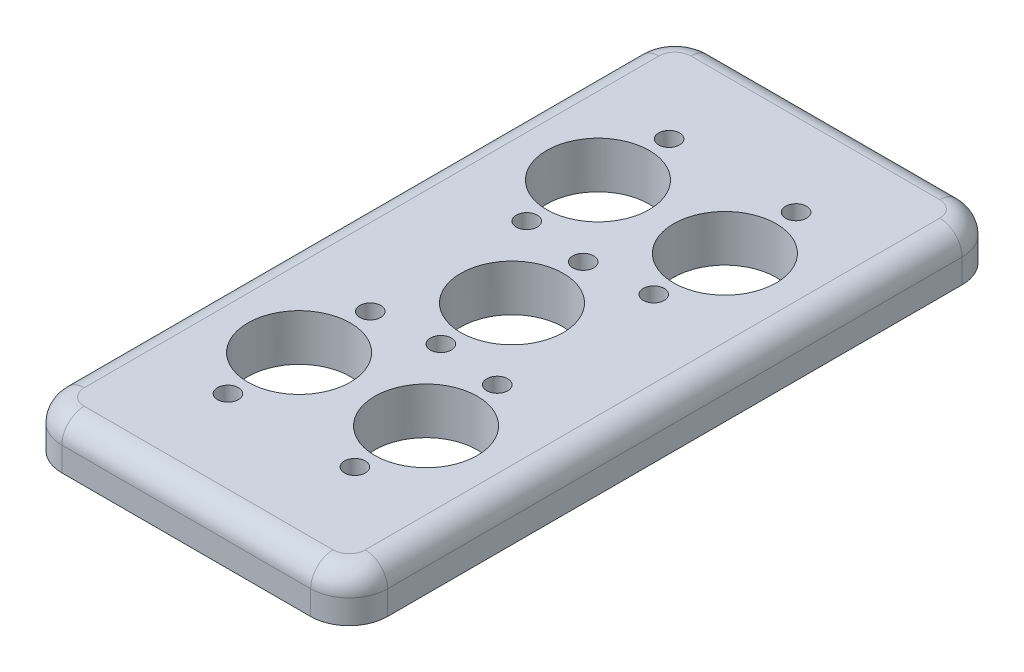
ISO-10303-21;
HEADER;
FILE_DESCRIPTION(('STEP AP214'),'2;1');
FILE_NAME('part.step','',(''),(''),'','','');
FILE_SCHEMA(('AUTOMOTIVE_DESIGN { 1 0 10303 214 1 1 1 1 }'));
ENDSEC;
DATA;
#1=APPLICATION_CONTEXT('core data for automotive mechanical design processes');
#2=APPLICATION_PROTOCOL_DEFINITION('international standard','automotive_design',2000,#1);
#3=PRODUCT_CONTEXT('',#1,'mechanical');
#4=PRODUCT('Part','Part','',(#3));
#5=PRODUCT_RELATED_PRODUCT_CATEGORY('part','',(#4));
#6=PRODUCT_DEFINITION_FORMATION('','',#4);
#7=PRODUCT_DEFINITION_CONTEXT('part definition',#1,'design');
#8=PRODUCT_DEFINITION('design','',#6,#7);
#9=PRODUCT_DEFINITION_SHAPE('','',#8);
#10=(LENGTH_UNIT() NAMED_UNIT(*) SI_UNIT(.MILLI.,.METRE.));
#11=(NAMED_UNIT(*) PLANE_ANGLE_UNIT() SI_UNIT($,.RADIAN.));
#12=(NAMED_UNIT(*) SI_UNIT($,.STERADIAN.) SOLID_ANGLE_UNIT());
#13=UNCERTAINTY_MEASURE_WITH_UNIT(LENGTH_MEASURE(1.E-05),#10,'distance_accuracy_value','');
#14=(GEOMETRIC_REPRESENTATION_CONTEXT(3) GLOBAL_UNCERTAINTY_ASSIGNED_CONTEXT((#13)) GLOBAL_UNIT_ASSIGNED_CONTEXT((#10,
#11,#12)) REPRESENTATION_CONTEXT('',''));
#15=CARTESIAN_POINT('',(0.,0.,0.));
#16=DIRECTION('',(0.,0.,1.));
#17=DIRECTION('',(1.,0.,0.));
#18=AXIS2_PLACEMENT_3D('',#15,#16,#17);
#19=CARTESIAN_POINT('',(25.4,7.25,-50.8));
#20=DIRECTION('',(-1.,0.,0.));
#21=DIRECTION('',(0.,0.,1.));
#22=AXIS2_PLACEMENT_3D('',#19,#20,#21);
#23=PLANE('',#22);
#24=DIRECTION('',(0.,-1.,0.));
#25=VECTOR('',#24,1.);
#26=CARTESIAN_POINT('',(25.4,7.25,-44.8));
#27=LINE('',#26,#25);
#28=CARTESIAN_POINT('',(25.4,0.,-44.8));
#29=VERTEX_POINT('',#28);
#30=CARTESIAN_POINT('',(25.4,3.75,-44.8));
#31=VERTEX_POINT('',#30);
#32=EDGE_CURVE('E135',#29,#31,#27,.F.);
#33=ORIENTED_EDGE('',*,*,#32,.T.);
#34=DIRECTION('',(0.,0.,-1.));
#35=VECTOR('',#34,1.);
#36=CARTESIAN_POINT('',(25.4,3.75,44.8));
#37=LINE('',#36,#35);
#38=CARTESIAN_POINT('',(25.4,3.75,44.8));
#39=VERTEX_POINT('',#38);
#40=EDGE_CURVE('E11',#31,#39,#37,.F.);
#41=ORIENTED_EDGE('',*,*,#40,.T.);
#42=DIRECTION('',(0.,-1.,0.));
#43=VECTOR('',#42,1.);
#44=CARTESIAN_POINT('',(25.4,7.25,44.8));
#45=LINE('',#44,#43);
#46=CARTESIAN_POINT('',(25.4,0.,44.8));
#47=VERTEX_POINT('',#46);
#48=EDGE_CURVE('E139',#39,#47,#45,.T.);
#49=ORIENTED_EDGE('',*,*,#48,.T.);
#50=DIRECTION('',(0.,0.,-1.));
#51=VECTOR('',#50,1.);
#52=CARTESIAN_POINT('',(25.4,0.,-50.8));
#53=LINE('',#52,#51);
#54=EDGE_CURVE('E146',#47,#29,#53,.T.);
#55=ORIENTED_EDGE('',*,*,#54,.T.);
#56=EDGE_LOOP('',(#33,#41,#49,#55));
#57=FACE_BOUND('',#56,.T.);
#58=ADVANCED_FACE('F34',(#57),#23,.F.);
#59=CARTESIAN_POINT('',(-25.4,7.25,-50.8));
#60=DIRECTION('',(0.,0.,1.));
#61=DIRECTION('',(1.,0.,0.));
#62=AXIS2_PLACEMENT_3D('',#59,#60,#61);
#63=PLANE('',#62);
#64=DIRECTION('',(0.,-1.,0.));
#65=VECTOR('',#64,1.);
#66=CARTESIAN_POINT('',(-19.4,7.25,-50.8));
#67=LINE('',#66,#65);
#68=CARTESIAN_POINT('',(-19.4,0.,-50.8));
#69=VERTEX_POINT('',#68);
#70=CARTESIAN_POINT('',(-19.4,3.75,-50.8));
#71=VERTEX_POINT('',#70);
#72=EDGE_CURVE('E131',#69,#71,#67,.F.);
#73=ORIENTED_EDGE('',*,*,#72,.T.);
#74=DIRECTION('',(-1.,0.,0.));
#75=VECTOR('',#74,1.);
#76=CARTESIAN_POINT('',(19.4,3.75,-50.8));
#77=LINE('',#76,#75);
#78=CARTESIAN_POINT('',(19.4,3.75,-50.8));
#79=VERTEX_POINT('',#78);
#80=EDGE_CURVE('E58',#71,#79,#77,.F.);
#81=ORIENTED_EDGE('',*,*,#80,.T.);
#82=DIRECTION('',(0.,-1.,0.));
#83=VECTOR('',#82,1.);
#84=CARTESIAN_POINT('',(19.4,7.25,-50.8));
#85=LINE('',#84,#83);
#86=CARTESIAN_POINT('',(19.4,0.,-50.8));
#87=VERTEX_POINT('',#86);
#88=EDGE_CURVE('E123',#79,#87,#85,.T.);
#89=ORIENTED_EDGE('',*,*,#88,.T.);
#90=DIRECTION('',(-1.,0.,0.));
#91=VECTOR('',#90,1.);
#92=CARTESIAN_POINT('',(-25.4,0.,-50.8));
#93=LINE('',#92,#91);
#94=EDGE_CURVE('E127',#87,#69,#93,.T.);
#95=ORIENTED_EDGE('',*,*,#94,.T.);
#96=EDGE_LOOP('',(#73,#81,#89,#95));
#97=FACE_BOUND('',#96,.T.);
#98=ADVANCED_FACE('F125',(#97),#63,.F.);
#99=CARTESIAN_POINT('',(-25.4,7.25,-50.8));
#100=DIRECTION('',(1.,0.,0.));
#101=DIRECTION('',(0.,0.,-1.));
#102=AXIS2_PLACEMENT_3D('',#99,#100,#101);
#103=PLANE('',#102);
#104=DIRECTION('',(0.,-1.,0.));
#105=VECTOR('',#104,1.);
#106=CARTESIAN_POINT('',(-25.4,7.25,44.8));
#107=LINE('',#106,#105);
#108=CARTESIAN_POINT('',(-25.4,0.,44.8));
#109=VERTEX_POINT('',#108);
#110=CARTESIAN_POINT('',(-25.4,3.75,44.8));
#111=VERTEX_POINT('',#110);
#112=EDGE_CURVE('E163',#109,#111,#107,.F.);
#113=ORIENTED_EDGE('',*,*,#112,.T.);
#114=DIRECTION('',(0.,0.,1.));
#115=VECTOR('',#114,1.);
#116=CARTESIAN_POINT('',(-25.4,3.75,-44.8));
#117=LINE('',#116,#115);
#118=CARTESIAN_POINT('',(-25.4,3.75,-44.8));
#119=VERTEX_POINT('',#118);
#120=EDGE_CURVE('E197',#111,#119,#117,.F.);
#121=ORIENTED_EDGE('',*,*,#120,.T.);
#122=DIRECTION('',(0.,-1.,0.));
#123=VECTOR('',#122,1.);
#124=CARTESIAN_POINT('',(-25.4,7.25,-44.8));
#125=LINE('',#124,#123);
#126=CARTESIAN_POINT('',(-25.4,0.,-44.8));
#127=VERTEX_POINT('',#126);
#128=EDGE_CURVE('E166',#119,#127,#125,.T.);
#129=ORIENTED_EDGE('',*,*,#128,.T.);
#130=DIRECTION('',(0.,0.,1.));
#131=VECTOR('',#130,1.);
#132=CARTESIAN_POINT('',(-25.4,0.,-50.8));
#133=LINE('',#132,#131);
#134=EDGE_CURVE('E145',#127,#109,#133,.T.);
#135=ORIENTED_EDGE('',*,*,#134,.T.);
#136=EDGE_LOOP('',(#113,#121,#129,#135));
#137=FACE_BOUND('',#136,.T.);
#138=ADVANCED_FACE('F238',(#137),#103,.F.);
#139=CARTESIAN_POINT('',(-25.4,7.25,50.8));
#140=DIRECTION('',(0.,0.,-1.));
#141=DIRECTION('',(-1.,0.,0.));
#142=AXIS2_PLACEMENT_3D('',#139,#140,#141);
#143=PLANE('',#142);
#144=DIRECTION('',(0.,-1.,0.));
#145=VECTOR('',#144,1.);
#146=CARTESIAN_POINT('',(19.4,7.25,50.8));
#147=LINE('',#146,#145);
#148=CARTESIAN_POINT('',(19.4,0.,50.8));
#149=VERTEX_POINT('',#148);
#150=CARTESIAN_POINT('',(19.4,3.75,50.8));
#151=VERTEX_POINT('',#150);
#152=EDGE_CURVE('E168',#149,#151,#147,.F.);
#153=ORIENTED_EDGE('',*,*,#152,.T.);
#154=DIRECTION('',(1.,0.,0.));
#155=VECTOR('',#154,1.);
#156=CARTESIAN_POINT('',(-19.4,3.75,50.8));
#157=LINE('',#156,#155);
#158=CARTESIAN_POINT('',(-19.4,3.75,50.8));
#159=VERTEX_POINT('',#158);
#160=EDGE_CURVE('E193',#151,#159,#157,.F.);
#161=ORIENTED_EDGE('',*,*,#160,.T.);
#162=DIRECTION('',(0.,-1.,0.));
#163=VECTOR('',#162,1.);
#164=CARTESIAN_POINT('',(-19.4,7.25,50.8));
#165=LINE('',#164,#163);
#166=CARTESIAN_POINT('',(-19.4,0.,50.8));
#167=VERTEX_POINT('',#166);
#168=EDGE_CURVE('E171',#159,#167,#165,.T.);
#169=ORIENTED_EDGE('',*,*,#168,.T.);
#170=DIRECTION('',(1.,0.,0.));
#171=VECTOR('',#170,1.);
#172=CARTESIAN_POINT('',(-25.4,0.,50.8));
#173=LINE('',#172,#171);
#174=EDGE_CURVE('E149',#167,#149,#173,.T.);
#175=ORIENTED_EDGE('',*,*,#174,.T.);
#176=EDGE_LOOP('',(#153,#161,#169,#175));
#177=FACE_BOUND('',#176,.T.);
#178=ADVANCED_FACE('F454',(#177),#143,.F.);
#179=CARTESIAN_POINT('',(25.4,7.25,50.8));
#180=DIRECTION('',(0.,1.,0.));
#181=DIRECTION('',(0.,0.,1.));
#182=AXIS2_PLACEMENT_3D('',#179,#180,#181);
#183=PLANE('',#182);
#184=CARTESIAN_POINT('',(9.90000000000001,7.25,12.2));
#185=DIRECTION('',(0.,1.,0.));
#186=DIRECTION('',(0.,0.,1.));
#187=AXIS2_PLACEMENT_3D('',#184,#185,#186);
#188=CIRCLE('',#187,1.63195);
#189=CARTESIAN_POINT('',(9.90000000000001,7.25,13.83195));
#190=VERTEX_POINT('',#189);
#191=EDGE_CURVE('E632',#190,#190,#188,.T.);
#192=ORIENTED_EDGE('',*,*,#191,.F.);
#193=EDGE_LOOP('',(#192));
#194=FACE_BOUND('',#193,.T.);
#195=CARTESIAN_POINT('',(9.90000000000001,7.25,34.4));
#196=DIRECTION('',(0.,1.,0.));
#197=DIRECTION('',(0.,0.,1.));
#198=AXIS2_PLACEMENT_3D('',#195,#196,#197);
#199=CIRCLE('',#198,1.63195);
#200=CARTESIAN_POINT('',(9.90000000000001,7.25,36.03195));
#201=VERTEX_POINT('',#200);
#202=EDGE_CURVE('E628',#201,#201,#199,.T.);
#203=ORIENTED_EDGE('',*,*,#202,.F.);
#204=EDGE_LOOP('',(#203));
#205=FACE_BOUND('',#204,.T.);
#206=CARTESIAN_POINT('',(-9.89999999999999,7.25,34.4));
#207=DIRECTION('',(0.,1.,0.));
#208=DIRECTION('',(0.,0.,1.));
#209=AXIS2_PLACEMENT_3D('',#206,#207,#208);
#210=CIRCLE('',#209,1.63195);
#211=CARTESIAN_POINT('',(-9.89999999999999,7.25,36.03195));
#212=VERTEX_POINT('',#211);
#213=EDGE_CURVE('E624',#212,#212,#210,.T.);
#214=ORIENTED_EDGE('',*,*,#213,.F.);
#215=EDGE_LOOP('',(#214));
#216=FACE_BOUND('',#215,.T.);
#217=CARTESIAN_POINT('',(-9.89999999999999,7.25,12.2));
#218=DIRECTION('',(0.,1.,0.));
#219=DIRECTION('',(0.,0.,1.));
#220=AXIS2_PLACEMENT_3D('',#217,#218,#219);
#221=CIRCLE('',#220,1.63195);
#222=CARTESIAN_POINT('',(-9.89999999999999,7.25,13.83195));
#223=VERTEX_POINT('',#222);
#224=EDGE_CURVE('E620',#223,#223,#221,.T.);
#225=ORIENTED_EDGE('',*,*,#224,.F.);
#226=EDGE_LOOP('',(#225));
#227=FACE_BOUND('',#226,.T.);
#228=CARTESIAN_POINT('',(0.,7.25,11.1));
#229=DIRECTION('',(0.,1.,0.));
#230=DIRECTION('',(0.,0.,1.));
#231=AXIS2_PLACEMENT_3D('',#228,#229,#230);
#232=CIRCLE('',#231,1.63195);
#233=CARTESIAN_POINT('',(0.,7.25,12.73195));
#234=VERTEX_POINT('',#233);
#235=EDGE_CURVE('E616',#234,#234,#232,.T.);
#236=ORIENTED_EDGE('',*,*,#235,.F.);
#237=EDGE_LOOP('',(#236));
#238=FACE_BOUND('',#237,.T.);
#239=CARTESIAN_POINT('',(0.,7.25,-11.1));
#240=DIRECTION('',(0.,1.,0.));
#241=DIRECTION('',(0.,0.,1.));
#242=AXIS2_PLACEMENT_3D('',#239,#240,#241);
#243=CIRCLE('',#242,1.63195);
#244=CARTESIAN_POINT('',(0.,7.25,-9.46805));
#245=VERTEX_POINT('',#244);
#246=EDGE_CURVE('E612',#245,#245,#243,.T.);
#247=ORIENTED_EDGE('',*,*,#246,.F.);
#248=EDGE_LOOP('',(#247));
#249=FACE_BOUND('',#248,.T.);
#250=CARTESIAN_POINT('',(-9.9,7.25,-12.2));
#251=DIRECTION('',(0.,1.,0.));
#252=DIRECTION('',(0.,0.,1.));
#253=AXIS2_PLACEMENT_3D('',#250,#251,#252);
#254=CIRCLE('',#253,1.63195);
#255=CARTESIAN_POINT('',(-9.9,7.25,-10.56805));
#256=VERTEX_POINT('',#255);
#257=EDGE_CURVE('E608',#256,#256,#254,.T.);
#258=ORIENTED_EDGE('',*,*,#257,.F.);
#259=EDGE_LOOP('',(#258));
#260=FACE_BOUND('',#259,.T.);
#261=CARTESIAN_POINT('',(9.9,7.25,-12.2));
#262=DIRECTION('',(0.,1.,0.));
#263=DIRECTION('',(0.,0.,1.));
#264=AXIS2_PLACEMENT_3D('',#261,#262,#263);
#265=CIRCLE('',#264,1.63195);
#266=CARTESIAN_POINT('',(9.9,7.25,-10.56805));
#267=VERTEX_POINT('',#266);
#268=EDGE_CURVE('E604',#267,#267,#265,.T.);
#269=ORIENTED_EDGE('',*,*,#268,.F.);
#270=EDGE_LOOP('',(#269));
#271=FACE_BOUND('',#270,.T.);
#272=CARTESIAN_POINT('',(-9.9,7.25,-34.4));
#273=DIRECTION('',(0.,1.,0.));
#274=DIRECTION('',(0.,0.,1.));
#275=AXIS2_PLACEMENT_3D('',#272,#273,#274);
#276=CIRCLE('',#275,1.63195);
#277=CARTESIAN_POINT('',(-9.9,7.25,-32.76805));
#278=VERTEX_POINT('',#277);
#279=EDGE_CURVE('E600',#278,#278,#276,.T.);
#280=ORIENTED_EDGE('',*,*,#279,.F.);
#281=EDGE_LOOP('',(#280));
#282=FACE_BOUND('',#281,.T.);
#283=CARTESIAN_POINT('',(9.9,7.25,-34.4));
#284=DIRECTION('',(0.,1.,0.));
#285=DIRECTION('',(0.,0.,1.));
#286=AXIS2_PLACEMENT_3D('',#283,#284,#285);
#287=CIRCLE('',#286,1.63195);
#288=CARTESIAN_POINT('',(9.9,7.25,-32.76805));
#289=VERTEX_POINT('',#288);
#290=EDGE_CURVE('E596',#289,#289,#287,.T.);
#291=ORIENTED_EDGE('',*,*,#290,.F.);
#292=EDGE_LOOP('',(#291));
#293=FACE_BOUND('',#292,.T.);
#294=CARTESIAN_POINT('',(-9.9,7.25,-23.3));
#295=DIRECTION('',(0.,1.,0.));
#296=DIRECTION('',(0.,0.,1.));
#297=AXIS2_PLACEMENT_3D('',#294,#295,#296);
#298=CIRCLE('',#297,8.);
#299=CARTESIAN_POINT('',(-9.9,7.25,-15.3));
#300=VERTEX_POINT('',#299);
#301=EDGE_CURVE('E591',#300,#300,#298,.F.);
#302=ORIENTED_EDGE('',*,*,#301,.T.);
#303=EDGE_LOOP('',(#302));
#304=FACE_BOUND('',#303,.T.);
#305=CARTESIAN_POINT('',(9.9,7.25,-23.3));
#306=DIRECTION('',(0.,1.,0.));
#307=DIRECTION('',(0.,0.,1.));
#308=AXIS2_PLACEMENT_3D('',#305,#306,#307);
#309=CIRCLE('',#308,8.);
#310=CARTESIAN_POINT('',(9.9,7.25,-15.3));
#311=VERTEX_POINT('',#310);
#312=EDGE_CURVE('E587',#311,#311,#309,.F.);
#313=ORIENTED_EDGE('',*,*,#312,.T.);
#314=EDGE_LOOP('',(#313));
#315=FACE_BOUND('',#314,.T.);
#316=CARTESIAN_POINT('',(-9.89999999999999,7.25,23.3));
#317=DIRECTION('',(0.,1.,0.));
#318=DIRECTION('',(0.,0.,1.));
#319=AXIS2_PLACEMENT_3D('',#316,#317,#318);
#320=CIRCLE('',#319,8.);
#321=CARTESIAN_POINT('',(-9.89999999999999,7.25,31.3));
#322=VERTEX_POINT('',#321);
#323=EDGE_CURVE('E583',#322,#322,#320,.F.);
#324=ORIENTED_EDGE('',*,*,#323,.T.);
#325=EDGE_LOOP('',(#324));
#326=FACE_BOUND('',#325,.T.);
#327=CARTESIAN_POINT('',(9.90000000000001,7.25,23.3));
#328=DIRECTION('',(0.,1.,0.));
#329=DIRECTION('',(0.,0.,1.));
#330=AXIS2_PLACEMENT_3D('',#327,#328,#329);
#331=CIRCLE('',#330,8.);
#332=CARTESIAN_POINT('',(9.90000000000001,7.25,31.3));
#333=VERTEX_POINT('',#332);
#334=EDGE_CURVE('E579',#333,#333,#331,.F.);
#335=ORIENTED_EDGE('',*,*,#334,.T.);
#336=EDGE_LOOP('',(#335));
#337=FACE_BOUND('',#336,.T.);
#338=CARTESIAN_POINT('',(0.,7.25,0.));
#339=DIRECTION('',(0.,1.,0.));
#340=DIRECTION('',(0.,0.,1.));
#341=AXIS2_PLACEMENT_3D('',#338,#339,#340);
#342=CIRCLE('',#341,8.);
#343=CARTESIAN_POINT('',(0.,7.25,8.));
#344=VERTEX_POINT('',#343);
#345=EDGE_CURVE('E575',#344,#344,#342,.F.);
#346=ORIENTED_EDGE('',*,*,#345,.T.);
#347=EDGE_LOOP('',(#346));
#348=FACE_BOUND('',#347,.T.);
#349=DIRECTION('',(1.,0.,0.));
#350=VECTOR('',#349,1.);
#351=CARTESIAN_POINT('',(19.4,7.25,47.3));
#352=LINE('',#351,#350);
#353=CARTESIAN_POINT('',(-19.4,7.25,47.3));
#354=VERTEX_POINT('',#353);
#355=CARTESIAN_POINT('',(19.4,7.25,47.3));
#356=VERTEX_POINT('',#355);
#357=EDGE_CURVE('E185',#354,#356,#352,.T.);
#358=ORIENTED_EDGE('',*,*,#357,.T.);
#359=CARTESIAN_POINT('',(19.4,7.25,44.8));
#360=DIRECTION('',(0.,1.,0.));
#361=DIRECTION('',(0.,0.,1.));
#362=AXIS2_PLACEMENT_3D('',#359,#360,#361);
#363=CIRCLE('',#362,2.5);
#364=CARTESIAN_POINT('',(21.9,7.25,44.8));
#365=VERTEX_POINT('',#364);
#366=EDGE_CURVE('E187',#356,#365,#363,.T.);
#367=ORIENTED_EDGE('',*,*,#366,.T.);
#368=DIRECTION('',(0.,0.,-1.));
#369=VECTOR('',#368,1.);
#370=CARTESIAN_POINT('',(21.9,7.25,-44.8));
#371=LINE('',#370,#369);
#372=CARTESIAN_POINT('',(21.9,7.25,-44.8));
#373=VERTEX_POINT('',#372);
#374=EDGE_CURVE('E173',#365,#373,#371,.T.);
#375=ORIENTED_EDGE('',*,*,#374,.T.);
#376=CARTESIAN_POINT('',(19.4,7.25,-44.8));
#377=DIRECTION('',(0.,1.,0.));
#378=DIRECTION('',(0.,0.,1.));
#379=AXIS2_PLACEMENT_3D('',#376,#377,#378);
#380=CIRCLE('',#379,2.5);
#381=CARTESIAN_POINT('',(19.4,7.25,-47.3));
#382=VERTEX_POINT('',#381);
#383=EDGE_CURVE('E175',#373,#382,#380,.T.);
#384=ORIENTED_EDGE('',*,*,#383,.T.);
#385=DIRECTION('',(-1.,0.,0.));
#386=VECTOR('',#385,1.);
#387=CARTESIAN_POINT('',(-19.4,7.25,-47.3));
#388=LINE('',#387,#386);
#389=CARTESIAN_POINT('',(-19.4,7.25,-47.3));
#390=VERTEX_POINT('',#389);
#391=EDGE_CURVE('E177',#382,#390,#388,.T.);
#392=ORIENTED_EDGE('',*,*,#391,.T.);
#393=CARTESIAN_POINT('',(-19.4,7.25,-44.8));
#394=DIRECTION('',(0.,1.,0.));
#395=DIRECTION('',(0.,0.,1.));
#396=AXIS2_PLACEMENT_3D('',#393,#394,#395);
#397=CIRCLE('',#396,2.5);
#398=CARTESIAN_POINT('',(-21.9,7.25,-44.8));
#399=VERTEX_POINT('',#398);
#400=EDGE_CURVE('E179',#390,#399,#397,.T.);
#401=ORIENTED_EDGE('',*,*,#400,.T.);
#402=DIRECTION('',(0.,0.,1.));
#403=VECTOR('',#402,1.);
#404=CARTESIAN_POINT('',(-21.9,7.25,44.8));
#405=LINE('',#404,#403);
#406=CARTESIAN_POINT('',(-21.9,7.25,44.8));
#407=VERTEX_POINT('',#406);
#408=EDGE_CURVE('E181',#399,#407,#405,.T.);
#409=ORIENTED_EDGE('',*,*,#408,.T.);
#410=CARTESIAN_POINT('',(-19.4,7.25,44.8));
#411=DIRECTION('',(0.,1.,0.));
#412=DIRECTION('',(0.,0.,1.));
#413=AXIS2_PLACEMENT_3D('',#410,#411,#412);
#414=CIRCLE('',#413,2.5);
#415=EDGE_CURVE('E183',#407,#354,#414,.T.);
#416=ORIENTED_EDGE('',*,*,#415,.T.);
#417=EDGE_LOOP('',(#358,#367,#375,#384,#392,#401,#409,#416));
#418=FACE_BOUND('',#417,.T.);
#419=ADVANCED_FACE('F257',(#194,#205,#216,#227,#238,#249,#260,#271,#282,#293,#304,#315,#326,
#337,#348,#418),#183,.T.);
#420=CARTESIAN_POINT('',(25.4,0.,50.8));
#421=DIRECTION('',(0.,1.,0.));
#422=DIRECTION('',(0.,0.,1.));
#423=AXIS2_PLACEMENT_3D('',#420,#421,#422);
#424=PLANE('',#423);
#425=CARTESIAN_POINT('',(9.90000000000001,0.,12.2));
#426=DIRECTION('',(0.,1.,0.));
#427=DIRECTION('',(0.,0.,1.));
#428=AXIS2_PLACEMENT_3D('',#425,#426,#427);
#429=CIRCLE('',#428,1.63195);
#430=CARTESIAN_POINT('',(9.90000000000001,0.,13.83195));
#431=VERTEX_POINT('',#430);
#432=EDGE_CURVE('E519',#431,#431,#429,.T.);
#433=ORIENTED_EDGE('',*,*,#432,.T.);
#434=EDGE_LOOP('',(#433));
#435=FACE_BOUND('',#434,.T.);
#436=CARTESIAN_POINT('',(9.90000000000001,0.,34.4));
#437=DIRECTION('',(0.,1.,0.));
#438=DIRECTION('',(0.,0.,1.));
#439=AXIS2_PLACEMENT_3D('',#436,#437,#438);
#440=CIRCLE('',#439,1.63195);
#441=CARTESIAN_POINT('',(9.90000000000001,0.,36.03195));
#442=VERTEX_POINT('',#441);
#443=EDGE_CURVE('E523',#442,#442,#440,.T.);
#444=ORIENTED_EDGE('',*,*,#443,.T.);
#445=EDGE_LOOP('',(#444));
#446=FACE_BOUND('',#445,.T.);
#447=CARTESIAN_POINT('',(-9.89999999999999,0.,34.4));
#448=DIRECTION('',(0.,1.,0.));
#449=DIRECTION('',(0.,0.,1.));
#450=AXIS2_PLACEMENT_3D('',#447,#448,#449);
#451=CIRCLE('',#450,1.63195);
#452=CARTESIAN_POINT('',(-9.89999999999999,0.,36.03195));
#453=VERTEX_POINT('',#452);
#454=EDGE_CURVE('E527',#453,#453,#451,.T.);
#455=ORIENTED_EDGE('',*,*,#454,.T.);
#456=EDGE_LOOP('',(#455));
#457=FACE_BOUND('',#456,.T.);
#458=CARTESIAN_POINT('',(-9.89999999999999,0.,12.2));
#459=DIRECTION('',(0.,1.,0.));
#460=DIRECTION('',(0.,0.,1.));
#461=AXIS2_PLACEMENT_3D('',#458,#459,#460);
#462=CIRCLE('',#461,1.63195);
#463=CARTESIAN_POINT('',(-9.89999999999999,0.,13.83195));
#464=VERTEX_POINT('',#463);
#465=EDGE_CURVE('E531',#464,#464,#462,.T.);
#466=ORIENTED_EDGE('',*,*,#465,.T.);
#467=EDGE_LOOP('',(#466));
#468=FACE_BOUND('',#467,.T.);
#469=CARTESIAN_POINT('',(0.,0.,11.1));
#470=DIRECTION('',(0.,1.,0.));
#471=DIRECTION('',(0.,0.,1.));
#472=AXIS2_PLACEMENT_3D('',#469,#470,#471);
#473=CIRCLE('',#472,1.63195);
#474=CARTESIAN_POINT('',(0.,0.,12.73195));
#475=VERTEX_POINT('',#474);
#476=EDGE_CURVE('E535',#475,#475,#473,.T.);
#477=ORIENTED_EDGE('',*,*,#476,.T.);
#478=EDGE_LOOP('',(#477));
#479=FACE_BOUND('',#478,.T.);
#480=CARTESIAN_POINT('',(0.,0.,-11.1));
#481=DIRECTION('',(0.,1.,0.));
#482=DIRECTION('',(0.,0.,1.));
#483=AXIS2_PLACEMENT_3D('',#480,#481,#482);
#484=CIRCLE('',#483,1.63195);
#485=CARTESIAN_POINT('',(0.,0.,-9.46805));
#486=VERTEX_POINT('',#485);
#487=EDGE_CURVE('E539',#486,#486,#484,.T.);
#488=ORIENTED_EDGE('',*,*,#487,.T.);
#489=EDGE_LOOP('',(#488));
#490=FACE_BOUND('',#489,.T.);
#491=CARTESIAN_POINT('',(-9.9,0.,-12.2));
#492=DIRECTION('',(0.,1.,0.));
#493=DIRECTION('',(0.,0.,1.));
#494=AXIS2_PLACEMENT_3D('',#491,#492,#493);
#495=CIRCLE('',#494,1.63195);
#496=CARTESIAN_POINT('',(-9.9,0.,-10.56805));
#497=VERTEX_POINT('',#496);
#498=EDGE_CURVE('E543',#497,#497,#495,.T.);
#499=ORIENTED_EDGE('',*,*,#498,.T.);
#500=EDGE_LOOP('',(#499));
#501=FACE_BOUND('',#500,.T.);
#502=CARTESIAN_POINT('',(9.9,0.,-12.2));
#503=DIRECTION('',(0.,1.,0.));
#504=DIRECTION('',(0.,0.,1.));
#505=AXIS2_PLACEMENT_3D('',#502,#503,#504);
#506=CIRCLE('',#505,1.63195);
#507=CARTESIAN_POINT('',(9.9,0.,-10.56805));
#508=VERTEX_POINT('',#507);
#509=EDGE_CURVE('E547',#508,#508,#506,.T.);
#510=ORIENTED_EDGE('',*,*,#509,.T.);
#511=EDGE_LOOP('',(#510));
#512=FACE_BOUND('',#511,.T.);
#513=CARTESIAN_POINT('',(-9.9,0.,-34.4));
#514=DIRECTION('',(0.,1.,0.));
#515=DIRECTION('',(0.,0.,1.));
#516=AXIS2_PLACEMENT_3D('',#513,#514,#515);
#517=CIRCLE('',#516,1.63195);
#518=CARTESIAN_POINT('',(-9.9,0.,-32.76805));
#519=VERTEX_POINT('',#518);
#520=EDGE_CURVE('E551',#519,#519,#517,.T.);
#521=ORIENTED_EDGE('',*,*,#520,.T.);
#522=EDGE_LOOP('',(#521));
#523=FACE_BOUND('',#522,.T.);
#524=CARTESIAN_POINT('',(9.9,0.,-34.4));
#525=DIRECTION('',(0.,1.,0.));
#526=DIRECTION('',(0.,0.,1.));
#527=AXIS2_PLACEMENT_3D('',#524,#525,#526);
#528=CIRCLE('',#527,1.63195);
#529=CARTESIAN_POINT('',(9.9,0.,-32.76805));
#530=VERTEX_POINT('',#529);
#531=EDGE_CURVE('E555',#530,#530,#528,.T.);
#532=ORIENTED_EDGE('',*,*,#531,.T.);
#533=EDGE_LOOP('',(#532));
#534=FACE_BOUND('',#533,.T.);
#535=CARTESIAN_POINT('',(-9.9,0.,-23.3));
#536=DIRECTION('',(0.,-1.,0.));
#537=DIRECTION('',(0.,0.,-1.));
#538=AXIS2_PLACEMENT_3D('',#535,#536,#537);
#539=CIRCLE('',#538,8.);
#540=CARTESIAN_POINT('',(-9.9,0.,-31.3));
#541=VERTEX_POINT('',#540);
#542=EDGE_CURVE('E559',#541,#541,#539,.T.);
#543=ORIENTED_EDGE('',*,*,#542,.F.);
#544=EDGE_LOOP('',(#543));
#545=FACE_BOUND('',#544,.T.);
#546=CARTESIAN_POINT('',(9.9,0.,-23.3));
#547=DIRECTION('',(0.,-1.,0.));
#548=DIRECTION('',(0.,0.,-1.));
#549=AXIS2_PLACEMENT_3D('',#546,#547,#548);
#550=CIRCLE('',#549,8.);
#551=CARTESIAN_POINT('',(9.9,0.,-31.3));
#552=VERTEX_POINT('',#551);
#553=EDGE_CURVE('E563',#552,#552,#550,.T.);
#554=ORIENTED_EDGE('',*,*,#553,.F.);
#555=EDGE_LOOP('',(#554));
#556=FACE_BOUND('',#555,.T.);
#557=CARTESIAN_POINT('',(-9.89999999999999,0.,23.3));
#558=DIRECTION('',(0.,-1.,0.));
#559=DIRECTION('',(0.,0.,-1.));
#560=AXIS2_PLACEMENT_3D('',#557,#558,#559);
#561=CIRCLE('',#560,8.);
#562=CARTESIAN_POINT('',(-9.89999999999999,0.,15.3));
#563=VERTEX_POINT('',#562);
#564=EDGE_CURVE('E567',#563,#563,#561,.T.);
#565=ORIENTED_EDGE('',*,*,#564,.F.);
#566=EDGE_LOOP('',(#565));
#567=FACE_BOUND('',#566,.T.);
#568=CARTESIAN_POINT('',(9.90000000000001,0.,23.3));
#569=DIRECTION('',(0.,-1.,0.));
#570=DIRECTION('',(0.,0.,-1.));
#571=AXIS2_PLACEMENT_3D('',#568,#569,#570);
#572=CIRCLE('',#571,8.);
#573=CARTESIAN_POINT('',(9.90000000000001,0.,15.3));
#574=VERTEX_POINT('',#573);
#575=EDGE_CURVE('E571',#574,#574,#572,.T.);
#576=ORIENTED_EDGE('',*,*,#575,.F.);
#577=EDGE_LOOP('',(#576));
#578=FACE_BOUND('',#577,.T.);
#579=CARTESIAN_POINT('',(0.,0.,0.));
#580=DIRECTION('',(0.,-1.,0.));
#581=DIRECTION('',(0.,0.,-1.));
#582=AXIS2_PLACEMENT_3D('',#579,#580,#581);
#583=CIRCLE('',#582,8.);
#584=CARTESIAN_POINT('',(0.,0.,-8.));
#585=VERTEX_POINT('',#584);
#586=EDGE_CURVE('E206',#585,#585,#583,.T.);
#587=ORIENTED_EDGE('',*,*,#586,.F.);
#588=EDGE_LOOP('',(#587));
#589=FACE_BOUND('',#588,.T.);
#590=ORIENTED_EDGE('',*,*,#94,.F.);
#591=CARTESIAN_POINT('',(19.4,0.,-44.8));
#592=DIRECTION('',(0.,1.,0.));
#593=DIRECTION('',(0.,0.,1.));
#594=AXIS2_PLACEMENT_3D('',#591,#592,#593);
#595=CIRCLE('',#594,6.);
#596=EDGE_CURVE('E133',#87,#29,#595,.F.);
#597=ORIENTED_EDGE('',*,*,#596,.T.);
#598=ORIENTED_EDGE('',*,*,#54,.F.);
#599=CARTESIAN_POINT('',(19.4,0.,44.8));
#600=DIRECTION('',(0.,1.,0.));
#601=DIRECTION('',(0.,0.,1.));
#602=AXIS2_PLACEMENT_3D('',#599,#600,#601);
#603=CIRCLE('',#602,6.);
#604=EDGE_CURVE('E130',#47,#149,#603,.F.);
#605=ORIENTED_EDGE('',*,*,#604,.T.);
#606=ORIENTED_EDGE('',*,*,#174,.F.);
#607=CARTESIAN_POINT('',(-19.4,0.,44.8));
#608=DIRECTION('',(0.,1.,0.));
#609=DIRECTION('',(0.,0.,1.));
#610=AXIS2_PLACEMENT_3D('',#607,#608,#609);
#611=CIRCLE('',#610,6.);
#612=EDGE_CURVE('E158',#167,#109,#611,.F.);
#613=ORIENTED_EDGE('',*,*,#612,.T.);
#614=ORIENTED_EDGE('',*,*,#134,.F.);
#615=CARTESIAN_POINT('',(-19.4,0.,-44.8));
#616=DIRECTION('',(0.,1.,0.));
#617=DIRECTION('',(0.,0.,1.));
#618=AXIS2_PLACEMENT_3D('',#615,#616,#617);
#619=CIRCLE('',#618,6.);
#620=EDGE_CURVE('E140',#127,#69,#619,.F.);
#621=ORIENTED_EDGE('',*,*,#620,.T.);
#622=EDGE_LOOP('',(#590,#597,#598,#605,#606,#613,#614,#621));
#623=FACE_BOUND('',#622,.T.);
#624=ADVANCED_FACE('F142',(#435,#446,#457,#468,#479,#490,#501,#512,#523,#534,#545,#556,#567,
#578,#589,#623),#424,.F.);
#625=CARTESIAN_POINT('',(19.4,7.25,-44.8));
#626=DIRECTION('',(0.,-1.,0.));
#627=DIRECTION('',(0.,0.,-1.));
#628=AXIS2_PLACEMENT_3D('',#625,#626,#627);
#629=CYLINDRICAL_SURFACE('',#628,6.);
#630=ORIENTED_EDGE('',*,*,#88,.F.);
#631=CARTESIAN_POINT('',(19.4,3.75,-44.8));
#632=DIRECTION('',(0.,1.,0.));
#633=DIRECTION('',(0.,0.,1.));
#634=AXIS2_PLACEMENT_3D('',#631,#632,#633);
#635=CIRCLE('',#634,6.);
#636=EDGE_CURVE('E43',#79,#31,#635,.F.);
#637=ORIENTED_EDGE('',*,*,#636,.T.);
#638=ORIENTED_EDGE('',*,*,#32,.F.);
#639=ORIENTED_EDGE('',*,*,#596,.F.);
#640=EDGE_LOOP('',(#630,#637,#638,#639));
#641=FACE_BOUND('',#640,.T.);
#642=ADVANCED_FACE('F134',(#641),#629,.T.);
#643=CARTESIAN_POINT('',(-19.4,7.25,-44.8));
#644=DIRECTION('',(0.,-1.,0.));
#645=DIRECTION('',(0.,0.,-1.));
#646=AXIS2_PLACEMENT_3D('',#643,#644,#645);
#647=CYLINDRICAL_SURFACE('',#646,6.);
#648=ORIENTED_EDGE('',*,*,#128,.F.);
#649=CARTESIAN_POINT('',(-19.4,3.75,-44.8));
#650=DIRECTION('',(0.,1.,0.));
#651=DIRECTION('',(0.,0.,1.));
#652=AXIS2_PLACEMENT_3D('',#649,#650,#651);
#653=CIRCLE('',#652,6.);
#654=EDGE_CURVE('E199',#119,#71,#653,.F.);
#655=ORIENTED_EDGE('',*,*,#654,.T.);
#656=ORIENTED_EDGE('',*,*,#72,.F.);
#657=ORIENTED_EDGE('',*,*,#620,.F.);
#658=EDGE_LOOP('',(#648,#655,#656,#657));
#659=FACE_BOUND('',#658,.T.);
#660=ADVANCED_FACE('F236',(#659),#647,.T.);
#661=CARTESIAN_POINT('',(-19.4,7.25,44.8));
#662=DIRECTION('',(0.,-1.,0.));
#663=DIRECTION('',(0.,0.,-1.));
#664=AXIS2_PLACEMENT_3D('',#661,#662,#663);
#665=CYLINDRICAL_SURFACE('',#664,6.);
#666=ORIENTED_EDGE('',*,*,#168,.F.);
#667=CARTESIAN_POINT('',(-19.4,3.75,44.8));
#668=DIRECTION('',(0.,1.,0.));
#669=DIRECTION('',(0.,0.,1.));
#670=AXIS2_PLACEMENT_3D('',#667,#668,#669);
#671=CIRCLE('',#670,6.);
#672=EDGE_CURVE('E195',#159,#111,#671,.F.);
#673=ORIENTED_EDGE('',*,*,#672,.T.);
#674=ORIENTED_EDGE('',*,*,#112,.F.);
#675=ORIENTED_EDGE('',*,*,#612,.F.);
#676=EDGE_LOOP('',(#666,#673,#674,#675));
#677=FACE_BOUND('',#676,.T.);
#678=ADVANCED_FACE('F243',(#677),#665,.T.);
#679=CARTESIAN_POINT('',(19.4,7.25,44.8));
#680=DIRECTION('',(0.,-1.,0.));
#681=DIRECTION('',(0.,0.,-1.));
#682=AXIS2_PLACEMENT_3D('',#679,#680,#681);
#683=CYLINDRICAL_SURFACE('',#682,6.);
#684=ORIENTED_EDGE('',*,*,#48,.F.);
#685=CARTESIAN_POINT('',(19.4,3.75,44.8));
#686=DIRECTION('',(0.,1.,0.));
#687=DIRECTION('',(0.,0.,1.));
#688=AXIS2_PLACEMENT_3D('',#685,#686,#687);
#689=CIRCLE('',#688,6.);
#690=EDGE_CURVE('E190',#39,#151,#689,.F.);
#691=ORIENTED_EDGE('',*,*,#690,.T.);
#692=ORIENTED_EDGE('',*,*,#152,.F.);
#693=ORIENTED_EDGE('',*,*,#604,.F.);
#694=EDGE_LOOP('',(#684,#691,#692,#693));
#695=FACE_BOUND('',#694,.T.);
#696=ADVANCED_FACE('F273',(#695),#683,.T.);
#697=CARTESIAN_POINT('',(-19.4,3.75,-44.8));
#698=DIRECTION('',(0.,1.,0.));
#699=DIRECTION('',(0.,0.,1.));
#700=AXIS2_PLACEMENT_3D('',#697,#698,#699);
#701=DEGENERATE_TOROIDAL_SURFACE('',#700,2.5,3.5,.T.);
#702=CARTESIAN_POINT('',(-19.4,3.75,-47.3));
#703=DIRECTION('',(1.,0.,0.));
#704=DIRECTION('',(0.,0.,-1.));
#705=AXIS2_PLACEMENT_3D('',#702,#703,#704);
#706=CIRCLE('',#705,3.5);
#707=EDGE_CURVE('E219',#71,#390,#706,.T.);
#708=ORIENTED_EDGE('',*,*,#707,.F.);
#709=ORIENTED_EDGE('',*,*,#654,.F.);
#710=CARTESIAN_POINT('',(-21.9,3.75,-44.8));
#711=DIRECTION('',(0.,0.,1.));
#712=DIRECTION('',(1.,0.,0.));
#713=AXIS2_PLACEMENT_3D('',#710,#711,#712);
#714=CIRCLE('',#713,3.5);
#715=EDGE_CURVE('E38',#399,#119,#714,.T.);
#716=ORIENTED_EDGE('',*,*,#715,.F.);
#717=ORIENTED_EDGE('',*,*,#400,.F.);
#718=EDGE_LOOP('',(#708,#709,#716,#717));
#719=FACE_BOUND('',#718,.T.);
#720=ADVANCED_FACE('F36',(#719),#701,.T.);
#721=CARTESIAN_POINT('',(-21.9,3.75,50.8));
#722=DIRECTION('',(0.,0.,-1.));
#723=DIRECTION('',(-1.,0.,0.));
#724=AXIS2_PLACEMENT_3D('',#721,#722,#723);
#725=CYLINDRICAL_SURFACE('',#724,3.5);
#726=ORIENTED_EDGE('',*,*,#715,.T.);
#727=ORIENTED_EDGE('',*,*,#120,.F.);
#728=CARTESIAN_POINT('',(-21.9,3.75,44.8));
#729=DIRECTION('',(0.,0.,1.));
#730=DIRECTION('',(1.,0.,0.));
#731=AXIS2_PLACEMENT_3D('',#728,#729,#730);
#732=CIRCLE('',#731,3.5);
#733=EDGE_CURVE('E217',#407,#111,#732,.T.);
#734=ORIENTED_EDGE('',*,*,#733,.F.);
#735=ORIENTED_EDGE('',*,*,#408,.F.);
#736=EDGE_LOOP('',(#726,#727,#734,#735));
#737=FACE_BOUND('',#736,.T.);
#738=ADVANCED_FACE('F229',(#737),#725,.T.);
#739=CARTESIAN_POINT('',(25.4,3.75,-47.3));
#740=DIRECTION('',(1.,0.,0.));
#741=DIRECTION('',(0.,0.,-1.));
#742=AXIS2_PLACEMENT_3D('',#739,#740,#741);
#743=CYLINDRICAL_SURFACE('',#742,3.5);
#744=ORIENTED_EDGE('',*,*,#707,.T.);
#745=ORIENTED_EDGE('',*,*,#391,.F.);
#746=CARTESIAN_POINT('',(19.4,3.75,-47.3));
#747=DIRECTION('',(1.,0.,0.));
#748=DIRECTION('',(0.,0.,-1.));
#749=AXIS2_PLACEMENT_3D('',#746,#747,#748);
#750=CIRCLE('',#749,3.5);
#751=EDGE_CURVE('E214',#79,#382,#750,.T.);
#752=ORIENTED_EDGE('',*,*,#751,.F.);
#753=ORIENTED_EDGE('',*,*,#80,.F.);
#754=EDGE_LOOP('',(#744,#745,#752,#753));
#755=FACE_BOUND('',#754,.T.);
#756=ADVANCED_FACE('F259',(#755),#743,.T.);
#757=CARTESIAN_POINT('',(-19.4,3.75,44.8));
#758=DIRECTION('',(0.,1.,0.));
#759=DIRECTION('',(0.,0.,1.));
#760=AXIS2_PLACEMENT_3D('',#757,#758,#759);
#761=DEGENERATE_TOROIDAL_SURFACE('',#760,2.5,3.5,.T.);
#762=ORIENTED_EDGE('',*,*,#733,.T.);
#763=ORIENTED_EDGE('',*,*,#672,.F.);
#764=CARTESIAN_POINT('',(-19.4,3.75,47.3));
#765=DIRECTION('',(1.,0.,0.));
#766=DIRECTION('',(0.,0.,-1.));
#767=AXIS2_PLACEMENT_3D('',#764,#765,#766);
#768=CIRCLE('',#767,3.5);
#769=EDGE_CURVE('E211',#354,#159,#768,.T.);
#770=ORIENTED_EDGE('',*,*,#769,.F.);
#771=ORIENTED_EDGE('',*,*,#415,.F.);
#772=EDGE_LOOP('',(#762,#763,#770,#771));
#773=FACE_BOUND('',#772,.T.);
#774=ADVANCED_FACE('F248',(#773),#761,.T.);
#775=CARTESIAN_POINT('',(19.4,3.75,-44.8));
#776=DIRECTION('',(0.,1.,0.));
#777=DIRECTION('',(0.,0.,1.));
#778=AXIS2_PLACEMENT_3D('',#775,#776,#777);
#779=DEGENERATE_TOROIDAL_SURFACE('',#778,2.5,3.5,.T.);
#780=ORIENTED_EDGE('',*,*,#751,.T.);
#781=ORIENTED_EDGE('',*,*,#383,.F.);
#782=CARTESIAN_POINT('',(21.9,3.75,-44.8));
#783=DIRECTION('',(0.,0.,1.));
#784=DIRECTION('',(1.,0.,0.));
#785=AXIS2_PLACEMENT_3D('',#782,#783,#784);
#786=CIRCLE('',#785,3.5);
#787=EDGE_CURVE('E208',#31,#373,#786,.T.);
#788=ORIENTED_EDGE('',*,*,#787,.F.);
#789=ORIENTED_EDGE('',*,*,#636,.F.);
#790=EDGE_LOOP('',(#780,#781,#788,#789));
#791=FACE_BOUND('',#790,.T.);
#792=ADVANCED_FACE('F261',(#791),#779,.T.);
#793=CARTESIAN_POINT('',(25.4,3.75,47.3));
#794=DIRECTION('',(-1.,0.,0.));
#795=DIRECTION('',(0.,0.,1.));
#796=AXIS2_PLACEMENT_3D('',#793,#794,#795);
#797=CYLINDRICAL_SURFACE('',#796,3.5);
#798=ORIENTED_EDGE('',*,*,#769,.T.);
#799=ORIENTED_EDGE('',*,*,#160,.F.);
#800=CARTESIAN_POINT('',(19.4,3.75,47.3));
#801=DIRECTION('',(1.,0.,0.));
#802=DIRECTION('',(0.,0.,-1.));
#803=AXIS2_PLACEMENT_3D('',#800,#801,#802);
#804=CIRCLE('',#803,3.5);
#805=EDGE_CURVE('E205',#356,#151,#804,.T.);
#806=ORIENTED_EDGE('',*,*,#805,.F.);
#807=ORIENTED_EDGE('',*,*,#357,.F.);
#808=EDGE_LOOP('',(#798,#799,#806,#807));
#809=FACE_BOUND('',#808,.T.);
#810=ADVANCED_FACE('F253',(#809),#797,.T.);
#811=CARTESIAN_POINT('',(21.9,3.75,50.8));
#812=DIRECTION('',(0.,0.,1.));
#813=DIRECTION('',(1.,0.,0.));
#814=AXIS2_PLACEMENT_3D('',#811,#812,#813);
#815=CYLINDRICAL_SURFACE('',#814,3.5);
#816=ORIENTED_EDGE('',*,*,#787,.T.);
#817=ORIENTED_EDGE('',*,*,#374,.F.);
#818=CARTESIAN_POINT('',(21.9,3.75,44.8));
#819=DIRECTION('',(0.,0.,1.));
#820=DIRECTION('',(1.,0.,0.));
#821=AXIS2_PLACEMENT_3D('',#818,#819,#820);
#822=CIRCLE('',#821,3.5);
#823=EDGE_CURVE('E203',#39,#365,#822,.T.);
#824=ORIENTED_EDGE('',*,*,#823,.F.);
#825=ORIENTED_EDGE('',*,*,#40,.F.);
#826=EDGE_LOOP('',(#816,#817,#824,#825));
#827=FACE_BOUND('',#826,.T.);
#828=ADVANCED_FACE('F267',(#827),#815,.T.);
#829=CARTESIAN_POINT('',(19.4,3.75,44.8));
#830=DIRECTION('',(0.,1.,0.));
#831=DIRECTION('',(0.,0.,1.));
#832=AXIS2_PLACEMENT_3D('',#829,#830,#831);
#833=DEGENERATE_TOROIDAL_SURFACE('',#832,2.5,3.5,.T.);
#834=ORIENTED_EDGE('',*,*,#805,.T.);
#835=ORIENTED_EDGE('',*,*,#690,.F.);
#836=ORIENTED_EDGE('',*,*,#823,.T.);
#837=ORIENTED_EDGE('',*,*,#366,.F.);
#838=EDGE_LOOP('',(#834,#835,#836,#837));
#839=FACE_BOUND('',#838,.T.);
#840=ADVANCED_FACE('F276',(#839),#833,.T.);
#841=CARTESIAN_POINT('',(0.,7.251,0.));
#842=DIRECTION('',(0.,-1.,0.));
#843=DIRECTION('',(0.,0.,-1.));
#844=AXIS2_PLACEMENT_3D('',#841,#842,#843);
#845=CYLINDRICAL_SURFACE('',#844,8.);
#846=ORIENTED_EDGE('',*,*,#345,.F.);
#847=EDGE_LOOP('',(#846));
#848=FACE_BOUND('',#847,.T.);
#849=ORIENTED_EDGE('',*,*,#586,.T.);
#850=EDGE_LOOP('',(#849));
#851=FACE_BOUND('',#850,.T.);
#852=ADVANCED_FACE('F278',(#848,#851),#845,.F.);
#853=CARTESIAN_POINT('',(9.90000000000001,7.251,23.3));
#854=DIRECTION('',(0.,-1.,0.));
#855=DIRECTION('',(0.,0.,-1.));
#856=AXIS2_PLACEMENT_3D('',#853,#854,#855);
#857=CYLINDRICAL_SURFACE('',#856,8.);
#858=ORIENTED_EDGE('',*,*,#334,.F.);
#859=EDGE_LOOP('',(#858));
#860=FACE_BOUND('',#859,.T.);
#861=ORIENTED_EDGE('',*,*,#575,.T.);
#862=EDGE_LOOP('',(#861));
#863=FACE_BOUND('',#862,.T.);
#864=ADVANCED_FACE('F284',(#860,#863),#857,.F.);
#865=CARTESIAN_POINT('',(-9.89999999999999,7.251,23.3));
#866=DIRECTION('',(0.,-1.,0.));
#867=DIRECTION('',(0.,0.,-1.));
#868=AXIS2_PLACEMENT_3D('',#865,#866,#867);
#869=CYLINDRICAL_SURFACE('',#868,8.);
#870=ORIENTED_EDGE('',*,*,#323,.F.);
#871=EDGE_LOOP('',(#870));
#872=FACE_BOUND('',#871,.T.);
#873=ORIENTED_EDGE('',*,*,#564,.T.);
#874=EDGE_LOOP('',(#873));
#875=FACE_BOUND('',#874,.T.);
#876=ADVANCED_FACE('F343',(#872,#875),#869,.F.);
#877=CARTESIAN_POINT('',(9.9,7.251,-23.3));
#878=DIRECTION('',(0.,-1.,0.));
#879=DIRECTION('',(0.,0.,-1.));
#880=AXIS2_PLACEMENT_3D('',#877,#878,#879);
#881=CYLINDRICAL_SURFACE('',#880,8.);
#882=ORIENTED_EDGE('',*,*,#312,.F.);
#883=EDGE_LOOP('',(#882));
#884=FACE_BOUND('',#883,.T.);
#885=ORIENTED_EDGE('',*,*,#553,.T.);
#886=EDGE_LOOP('',(#885));
#887=FACE_BOUND('',#886,.T.);
#888=ADVANCED_FACE('F351',(#884,#887),#881,.F.);
#889=CARTESIAN_POINT('',(-9.9,7.251,-23.3));
#890=DIRECTION('',(0.,-1.,0.));
#891=DIRECTION('',(0.,0.,-1.));
#892=AXIS2_PLACEMENT_3D('',#889,#890,#891);
#893=CYLINDRICAL_SURFACE('',#892,8.);
#894=ORIENTED_EDGE('',*,*,#301,.F.);
#895=EDGE_LOOP('',(#894));
#896=FACE_BOUND('',#895,.T.);
#897=ORIENTED_EDGE('',*,*,#542,.T.);
#898=EDGE_LOOP('',(#897));
#899=FACE_BOUND('',#898,.T.);
#900=ADVANCED_FACE('F359',(#896,#899),#893,.F.);
#901=CARTESIAN_POINT('',(9.9,7.25,-34.4));
#902=DIRECTION('',(0.,1.,0.));
#903=DIRECTION('',(0.,0.,1.));
#904=AXIS2_PLACEMENT_3D('',#901,#902,#903);
#905=CYLINDRICAL_SURFACE('',#904,1.63195);
#906=ORIENTED_EDGE('',*,*,#531,.F.);
#907=EDGE_LOOP('',(#906));
#908=FACE_BOUND('',#907,.T.);
#909=ORIENTED_EDGE('',*,*,#290,.T.);
#910=EDGE_LOOP('',(#909));
#911=FACE_BOUND('',#910,.T.);
#912=ADVANCED_FACE('F367',(#908,#911),#905,.F.);
#913=CARTESIAN_POINT('',(-9.9,7.25,-34.4));
#914=DIRECTION('',(0.,1.,0.));
#915=DIRECTION('',(0.,0.,1.));
#916=AXIS2_PLACEMENT_3D('',#913,#914,#915);
#917=CYLINDRICAL_SURFACE('',#916,1.63195);
#918=ORIENTED_EDGE('',*,*,#520,.F.);
#919=EDGE_LOOP('',(#918));
#920=FACE_BOUND('',#919,.T.);
#921=ORIENTED_EDGE('',*,*,#279,.T.);
#922=EDGE_LOOP('',(#921));
#923=FACE_BOUND('',#922,.T.);
#924=ADVANCED_FACE('F375',(#920,#923),#917,.F.);
#925=CARTESIAN_POINT('',(9.9,7.25,-12.2));
#926=DIRECTION('',(0.,1.,0.));
#927=DIRECTION('',(0.,0.,1.));
#928=AXIS2_PLACEMENT_3D('',#925,#926,#927);
#929=CYLINDRICAL_SURFACE('',#928,1.63195);
#930=ORIENTED_EDGE('',*,*,#509,.F.);
#931=EDGE_LOOP('',(#930));
#932=FACE_BOUND('',#931,.T.);
#933=ORIENTED_EDGE('',*,*,#268,.T.);
#934=EDGE_LOOP('',(#933));
#935=FACE_BOUND('',#934,.T.);
#936=ADVANCED_FACE('F383',(#932,#935),#929,.F.);
#937=CARTESIAN_POINT('',(-9.9,7.25,-12.2));
#938=DIRECTION('',(0.,1.,0.));
#939=DIRECTION('',(0.,0.,1.));
#940=AXIS2_PLACEMENT_3D('',#937,#938,#939);
#941=CYLINDRICAL_SURFACE('',#940,1.63195);
#942=ORIENTED_EDGE('',*,*,#498,.F.);
#943=EDGE_LOOP('',(#942));
#944=FACE_BOUND('',#943,.T.);
#945=ORIENTED_EDGE('',*,*,#257,.T.);
#946=EDGE_LOOP('',(#945));
#947=FACE_BOUND('',#946,.T.);
#948=ADVANCED_FACE('F391',(#944,#947),#941,.F.);
#949=CARTESIAN_POINT('',(0.,7.25,-11.1));
#950=DIRECTION('',(0.,1.,0.));
#951=DIRECTION('',(0.,0.,1.));
#952=AXIS2_PLACEMENT_3D('',#949,#950,#951);
#953=CYLINDRICAL_SURFACE('',#952,1.63195);
#954=ORIENTED_EDGE('',*,*,#487,.F.);
#955=EDGE_LOOP('',(#954));
#956=FACE_BOUND('',#955,.T.);
#957=ORIENTED_EDGE('',*,*,#246,.T.);
#958=EDGE_LOOP('',(#957));
#959=FACE_BOUND('',#958,.T.);
#960=ADVANCED_FACE('F399',(#956,#959),#953,.F.);
#961=CARTESIAN_POINT('',(0.,7.25,11.1));
#962=DIRECTION('',(0.,1.,0.));
#963=DIRECTION('',(0.,0.,1.));
#964=AXIS2_PLACEMENT_3D('',#961,#962,#963);
#965=CYLINDRICAL_SURFACE('',#964,1.63195);
#966=ORIENTED_EDGE('',*,*,#476,.F.);
#967=EDGE_LOOP('',(#966));
#968=FACE_BOUND('',#967,.T.);
#969=ORIENTED_EDGE('',*,*,#235,.T.);
#970=EDGE_LOOP('',(#969));
#971=FACE_BOUND('',#970,.T.);
#972=ADVANCED_FACE('F407',(#968,#971),#965,.F.);
#973=CARTESIAN_POINT('',(-9.89999999999999,7.25,12.2));
#974=DIRECTION('',(0.,1.,0.));
#975=DIRECTION('',(0.,0.,1.));
#976=AXIS2_PLACEMENT_3D('',#973,#974,#975);
#977=CYLINDRICAL_SURFACE('',#976,1.63195);
#978=ORIENTED_EDGE('',*,*,#465,.F.);
#979=EDGE_LOOP('',(#978));
#980=FACE_BOUND('',#979,.T.);
#981=ORIENTED_EDGE('',*,*,#224,.T.);
#982=EDGE_LOOP('',(#981));
#983=FACE_BOUND('',#982,.T.);
#984=ADVANCED_FACE('F415',(#980,#983),#977,.F.);
#985=CARTESIAN_POINT('',(-9.89999999999999,7.25,34.4));
#986=DIRECTION('',(0.,1.,0.));
#987=DIRECTION('',(0.,0.,1.));
#988=AXIS2_PLACEMENT_3D('',#985,#986,#987);
#989=CYLINDRICAL_SURFACE('',#988,1.63195);
#990=ORIENTED_EDGE('',*,*,#454,.F.);
#991=EDGE_LOOP('',(#990));
#992=FACE_BOUND('',#991,.T.);
#993=ORIENTED_EDGE('',*,*,#213,.T.);
#994=EDGE_LOOP('',(#993));
#995=FACE_BOUND('',#994,.T.);
#996=ADVANCED_FACE('F423',(#992,#995),#989,.F.);
#997=CARTESIAN_POINT('',(9.90000000000001,7.25,34.4));
#998=DIRECTION('',(0.,1.,0.));
#999=DIRECTION('',(0.,0.,1.));
#1000=AXIS2_PLACEMENT_3D('',#997,#998,#999);
#1001=CYLINDRICAL_SURFACE('',#1000,1.63195);
#1002=ORIENTED_EDGE('',*,*,#443,.F.);
#1003=EDGE_LOOP('',(#1002));
#1004=FACE_BOUND('',#1003,.T.);
#1005=ORIENTED_EDGE('',*,*,#202,.T.);
#1006=EDGE_LOOP('',(#1005));
#1007=FACE_BOUND('',#1006,.T.);
#1008=ADVANCED_FACE('F431',(#1004,#1007),#1001,.F.);
#1009=CARTESIAN_POINT('',(9.90000000000001,7.25,12.2));
#1010=DIRECTION('',(0.,1.,0.));
#1011=DIRECTION('',(0.,0.,1.));
#1012=AXIS2_PLACEMENT_3D('',#1009,#1010,#1011);
#1013=CYLINDRICAL_SURFACE('',#1012,1.63195);
#1014=ORIENTED_EDGE('',*,*,#432,.F.);
#1015=EDGE_LOOP('',(#1014));
#1016=FACE_BOUND('',#1015,.T.);
#1017=ORIENTED_EDGE('',*,*,#191,.T.);
#1018=EDGE_LOOP('',(#1017));
#1019=FACE_BOUND('',#1018,.T.);
#1020=ADVANCED_FACE('F439',(#1016,#1019),#1013,.F.);
#1021=CLOSED_SHELL('',(#58,#98,#138,#178,#419,#624,#642,#660,#678,#696,#720,#738,#756,#774,#792,
#810,#828,#840,#852,#864,#876,#888,#900,#912,#924,#936,#948,#960,#972,#984,#996,#1008,#1020));
#1022=MANIFOLD_SOLID_BREP('B2',#1021);
#1023=ADVANCED_BREP_SHAPE_REPRESENTATION('',(#18,#1022),#14);
#1024=SHAPE_DEFINITION_REPRESENTATION(#9,#1023);
ENDSEC;
END-ISO-10303-21;
